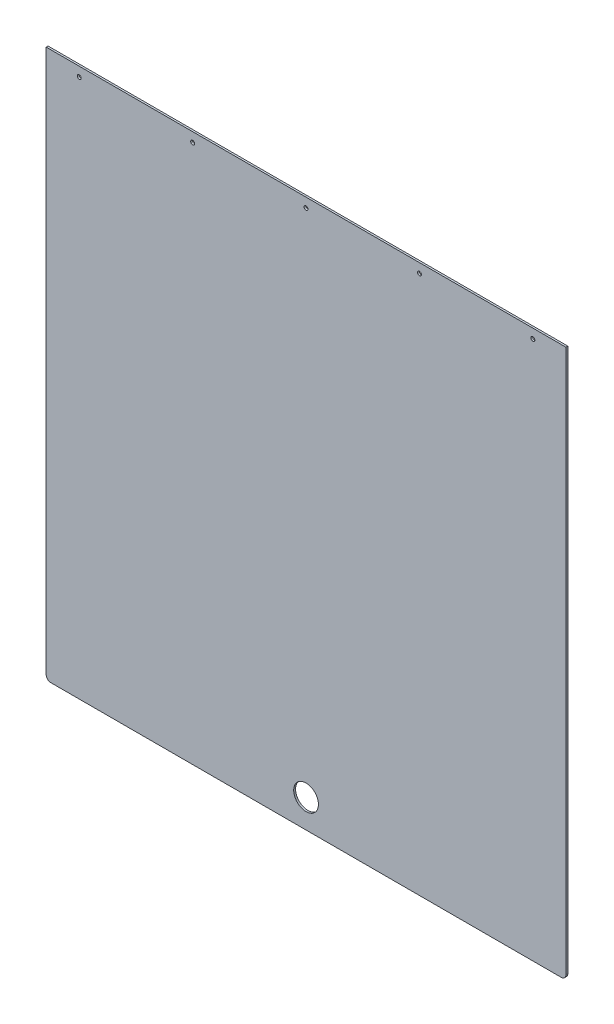
ISO-10303-21;
HEADER;
FILE_DESCRIPTION(('STEP AP214'),'2;1');
FILE_NAME('part.step','',(''),(''),'','','');
FILE_SCHEMA(('AUTOMOTIVE_DESIGN { 1 0 10303 214 1 1 1 1 }'));
ENDSEC;
DATA;
#1=APPLICATION_CONTEXT('core data for automotive mechanical design processes');
#2=APPLICATION_PROTOCOL_DEFINITION('international standard','automotive_design',2000,#1);
#3=PRODUCT_CONTEXT('',#1,'mechanical');
#4=PRODUCT('Part','Part','',(#3));
#5=PRODUCT_RELATED_PRODUCT_CATEGORY('part','',(#4));
#6=PRODUCT_DEFINITION_FORMATION('','',#4);
#7=PRODUCT_DEFINITION_CONTEXT('part definition',#1,'design');
#8=PRODUCT_DEFINITION('design','',#6,#7);
#9=PRODUCT_DEFINITION_SHAPE('','',#8);
#10=(LENGTH_UNIT() NAMED_UNIT(*) SI_UNIT(.MILLI.,.METRE.));
#11=(NAMED_UNIT(*) PLANE_ANGLE_UNIT() SI_UNIT($,.RADIAN.));
#12=(NAMED_UNIT(*) SI_UNIT($,.STERADIAN.) SOLID_ANGLE_UNIT());
#13=UNCERTAINTY_MEASURE_WITH_UNIT(LENGTH_MEASURE(1.E-05),#10,'distance_accuracy_value','');
#14=(GEOMETRIC_REPRESENTATION_CONTEXT(3) GLOBAL_UNCERTAINTY_ASSIGNED_CONTEXT((#13)) GLOBAL_UNIT_ASSIGNED_CONTEXT((#10,
#11,#12)) REPRESENTATION_CONTEXT('',''));
#15=CARTESIAN_POINT('',(0.,0.,0.));
#16=DIRECTION('',(0.,0.,1.));
#17=DIRECTION('',(1.,0.,0.));
#18=AXIS2_PLACEMENT_3D('',#15,#16,#17);
#19=CARTESIAN_POINT('',(275.,-290.,-2.));
#20=DIRECTION('',(1.,0.,0.));
#21=DIRECTION('',(0.,0.,-1.));
#22=AXIS2_PLACEMENT_3D('',#19,#20,#21);
#23=PLANE('',#22);
#24=DIRECTION('',(0.,1.,0.));
#25=VECTOR('',#24,1.);
#26=CARTESIAN_POINT('',(275.,-290.,0.));
#27=LINE('',#26,#25);
#28=CARTESIAN_POINT('',(275.,-285.,0.));
#29=VERTEX_POINT('',#28);
#30=CARTESIAN_POINT('',(275.,290.,0.));
#31=VERTEX_POINT('',#30);
#32=EDGE_CURVE('E111',#29,#31,#27,.T.);
#33=ORIENTED_EDGE('',*,*,#32,.F.);
#34=DIRECTION('',(0.,0.,1.));
#35=VECTOR('',#34,1.);
#36=CARTESIAN_POINT('',(275.,-285.,-2.));
#37=LINE('',#36,#35);
#38=CARTESIAN_POINT('',(275.,-285.,-2.));
#39=VERTEX_POINT('',#38);
#40=EDGE_CURVE('E11',#29,#39,#37,.F.);
#41=ORIENTED_EDGE('',*,*,#40,.T.);
#42=DIRECTION('',(0.,1.,0.));
#43=VECTOR('',#42,1.);
#44=CARTESIAN_POINT('',(275.,-290.,-2.));
#45=LINE('',#44,#43);
#46=CARTESIAN_POINT('',(275.,290.,-2.));
#47=VERTEX_POINT('',#46);
#48=EDGE_CURVE('E86',#39,#47,#45,.T.);
#49=ORIENTED_EDGE('',*,*,#48,.T.);
#50=DIRECTION('',(0.,0.,1.));
#51=VECTOR('',#50,1.);
#52=CARTESIAN_POINT('',(275.,290.,-2.));
#53=LINE('',#52,#51);
#54=EDGE_CURVE('E88',#47,#31,#53,.T.);
#55=ORIENTED_EDGE('',*,*,#54,.T.);
#56=EDGE_LOOP('',(#33,#41,#49,#55));
#57=FACE_BOUND('',#56,.T.);
#58=ADVANCED_FACE('F35',(#57),#23,.T.);
#59=CARTESIAN_POINT('',(-275.,-290.,-2.));
#60=DIRECTION('',(0.,-1.,0.));
#61=DIRECTION('',(0.,0.,-1.));
#62=AXIS2_PLACEMENT_3D('',#59,#60,#61);
#63=PLANE('',#62);
#64=DIRECTION('',(1.,0.,0.));
#65=VECTOR('',#64,1.);
#66=CARTESIAN_POINT('',(-275.,-290.,0.));
#67=LINE('',#66,#65);
#68=CARTESIAN_POINT('',(-270.,-290.,0.));
#69=VERTEX_POINT('',#68);
#70=CARTESIAN_POINT('',(270.,-290.,0.));
#71=VERTEX_POINT('',#70);
#72=EDGE_CURVE('E92',#69,#71,#67,.T.);
#73=ORIENTED_EDGE('',*,*,#72,.F.);
#74=DIRECTION('',(0.,0.,1.));
#75=VECTOR('',#74,1.);
#76=CARTESIAN_POINT('',(-270.,-290.,-2.));
#77=LINE('',#76,#75);
#78=CARTESIAN_POINT('',(-270.,-290.,-2.));
#79=VERTEX_POINT('',#78);
#80=EDGE_CURVE('E131',#69,#79,#77,.F.);
#81=ORIENTED_EDGE('',*,*,#80,.T.);
#82=DIRECTION('',(1.,0.,0.));
#83=VECTOR('',#82,1.);
#84=CARTESIAN_POINT('',(-275.,-290.,-2.));
#85=LINE('',#84,#83);
#86=CARTESIAN_POINT('',(270.,-290.,-2.));
#87=VERTEX_POINT('',#86);
#88=EDGE_CURVE('E100',#79,#87,#85,.T.);
#89=ORIENTED_EDGE('',*,*,#88,.T.);
#90=DIRECTION('',(0.,0.,1.));
#91=VECTOR('',#90,1.);
#92=CARTESIAN_POINT('',(270.,-290.,-2.));
#93=LINE('',#92,#91);
#94=EDGE_CURVE('E128',#87,#71,#93,.T.);
#95=ORIENTED_EDGE('',*,*,#94,.T.);
#96=EDGE_LOOP('',(#73,#81,#89,#95));
#97=FACE_BOUND('',#96,.T.);
#98=ADVANCED_FACE('F145',(#97),#63,.T.);
#99=CARTESIAN_POINT('',(-275.,-290.,-2.));
#100=DIRECTION('',(-1.,0.,0.));
#101=DIRECTION('',(0.,0.,1.));
#102=AXIS2_PLACEMENT_3D('',#99,#100,#101);
#103=PLANE('',#102);
#104=DIRECTION('',(0.,-1.,0.));
#105=VECTOR('',#104,1.);
#106=CARTESIAN_POINT('',(-275.,-290.,-2.));
#107=LINE('',#106,#105);
#108=CARTESIAN_POINT('',(-275.,290.,-2.));
#109=VERTEX_POINT('',#108);
#110=CARTESIAN_POINT('',(-275.,-285.,-2.));
#111=VERTEX_POINT('',#110);
#112=EDGE_CURVE('E105',#109,#111,#107,.T.);
#113=ORIENTED_EDGE('',*,*,#112,.T.);
#114=DIRECTION('',(0.,0.,1.));
#115=VECTOR('',#114,1.);
#116=CARTESIAN_POINT('',(-275.,-285.,-2.));
#117=LINE('',#116,#115);
#118=CARTESIAN_POINT('',(-275.,-285.,0.));
#119=VERTEX_POINT('',#118);
#120=EDGE_CURVE('E120',#111,#119,#117,.T.);
#121=ORIENTED_EDGE('',*,*,#120,.T.);
#122=DIRECTION('',(0.,-1.,0.));
#123=VECTOR('',#122,1.);
#124=CARTESIAN_POINT('',(-275.,-290.,0.));
#125=LINE('',#124,#123);
#126=CARTESIAN_POINT('',(-275.,290.,0.));
#127=VERTEX_POINT('',#126);
#128=EDGE_CURVE('E115',#127,#119,#125,.T.);
#129=ORIENTED_EDGE('',*,*,#128,.F.);
#130=DIRECTION('',(0.,0.,1.));
#131=VECTOR('',#130,1.);
#132=CARTESIAN_POINT('',(-275.,290.,-2.));
#133=LINE('',#132,#131);
#134=EDGE_CURVE('E99',#109,#127,#133,.T.);
#135=ORIENTED_EDGE('',*,*,#134,.F.);
#136=EDGE_LOOP('',(#113,#121,#129,#135));
#137=FACE_BOUND('',#136,.T.);
#138=ADVANCED_FACE('F138',(#137),#103,.T.);
#139=CARTESIAN_POINT('',(-275.,290.,-2.));
#140=DIRECTION('',(0.,1.,0.));
#141=DIRECTION('',(0.,0.,1.));
#142=AXIS2_PLACEMENT_3D('',#139,#140,#141);
#143=PLANE('',#142);
#144=DIRECTION('',(-1.,0.,0.));
#145=VECTOR('',#144,1.);
#146=CARTESIAN_POINT('',(-275.,290.,0.));
#147=LINE('',#146,#145);
#148=EDGE_CURVE('E98',#31,#127,#147,.T.);
#149=ORIENTED_EDGE('',*,*,#148,.F.);
#150=ORIENTED_EDGE('',*,*,#54,.F.);
#151=DIRECTION('',(-1.,0.,0.));
#152=VECTOR('',#151,1.);
#153=CARTESIAN_POINT('',(-275.,290.,-2.));
#154=LINE('',#153,#152);
#155=EDGE_CURVE('E91',#47,#109,#154,.T.);
#156=ORIENTED_EDGE('',*,*,#155,.T.);
#157=ORIENTED_EDGE('',*,*,#134,.T.);
#158=EDGE_LOOP('',(#149,#150,#156,#157));
#159=FACE_BOUND('',#158,.T.);
#160=ADVANCED_FACE('F96',(#159),#143,.T.);
#161=CARTESIAN_POINT('',(0.,0.,-2.));
#162=DIRECTION('',(0.,0.,-1.));
#163=DIRECTION('',(-1.,0.,0.));
#164=AXIS2_PLACEMENT_3D('',#161,#162,#163);
#165=PLANE('',#164);
#166=CARTESIAN_POINT('',(0.,-260.,-2.));
#167=DIRECTION('',(0.,0.,-1.));
#168=DIRECTION('',(-1.,0.,0.));
#169=AXIS2_PLACEMENT_3D('',#166,#167,#168);
#170=CIRCLE('',#169,13.1);
#171=CARTESIAN_POINT('',(-13.0999999999999,-260.,-2.));
#172=VERTEX_POINT('',#171);
#173=EDGE_CURVE('E197',#172,#172,#170,.T.);
#174=ORIENTED_EDGE('',*,*,#173,.F.);
#175=EDGE_LOOP('',(#174));
#176=FACE_BOUND('',#175,.T.);
#177=CARTESIAN_POINT('',(-120.,280.,-2.));
#178=DIRECTION('',(0.,0.,-1.));
#179=DIRECTION('',(-1.,0.,0.));
#180=AXIS2_PLACEMENT_3D('',#177,#178,#179);
#181=CIRCLE('',#180,2.1);
#182=CARTESIAN_POINT('',(-122.1,280.,-2.));
#183=VERTEX_POINT('',#182);
#184=EDGE_CURVE('E201',#183,#183,#181,.F.);
#185=ORIENTED_EDGE('',*,*,#184,.T.);
#186=EDGE_LOOP('',(#185));
#187=FACE_BOUND('',#186,.T.);
#188=CARTESIAN_POINT('',(-240.,280.,-2.));
#189=DIRECTION('',(0.,0.,-1.));
#190=DIRECTION('',(-1.,0.,0.));
#191=AXIS2_PLACEMENT_3D('',#188,#189,#190);
#192=CIRCLE('',#191,2.09999999999999);
#193=CARTESIAN_POINT('',(-242.1,280.,-2.));
#194=VERTEX_POINT('',#193);
#195=EDGE_CURVE('E224',#194,#194,#192,.F.);
#196=ORIENTED_EDGE('',*,*,#195,.T.);
#197=EDGE_LOOP('',(#196));
#198=FACE_BOUND('',#197,.T.);
#199=CARTESIAN_POINT('',(240.,280.,-2.));
#200=DIRECTION('',(0.,0.,-1.));
#201=DIRECTION('',(-1.,0.,0.));
#202=AXIS2_PLACEMENT_3D('',#199,#200,#201);
#203=CIRCLE('',#202,2.09999999999999);
#204=CARTESIAN_POINT('',(237.9,280.,-2.));
#205=VERTEX_POINT('',#204);
#206=EDGE_CURVE('E218',#205,#205,#203,.F.);
#207=ORIENTED_EDGE('',*,*,#206,.T.);
#208=EDGE_LOOP('',(#207));
#209=FACE_BOUND('',#208,.T.);
#210=CARTESIAN_POINT('',(120.,280.,-2.));
#211=DIRECTION('',(0.,0.,-1.));
#212=DIRECTION('',(-1.,0.,0.));
#213=AXIS2_PLACEMENT_3D('',#210,#211,#212);
#214=CIRCLE('',#213,2.1);
#215=CARTESIAN_POINT('',(117.9,280.,-2.));
#216=VERTEX_POINT('',#215);
#217=EDGE_CURVE('E212',#216,#216,#214,.F.);
#218=ORIENTED_EDGE('',*,*,#217,.T.);
#219=EDGE_LOOP('',(#218));
#220=FACE_BOUND('',#219,.T.);
#221=CARTESIAN_POINT('',(0.,280.,-2.));
#222=DIRECTION('',(0.,0.,-1.));
#223=DIRECTION('',(-1.,0.,0.));
#224=AXIS2_PLACEMENT_3D('',#221,#222,#223);
#225=CIRCLE('',#224,2.1);
#226=CARTESIAN_POINT('',(-2.1,280.,-2.));
#227=VERTEX_POINT('',#226);
#228=EDGE_CURVE('E211',#227,#227,#225,.F.);
#229=ORIENTED_EDGE('',*,*,#228,.T.);
#230=EDGE_LOOP('',(#229));
#231=FACE_BOUND('',#230,.T.);
#232=ORIENTED_EDGE('',*,*,#88,.F.);
#233=CARTESIAN_POINT('',(-270.,-285.,-2.));
#234=DIRECTION('',(0.,0.,-1.));
#235=DIRECTION('',(-1.,0.,0.));
#236=AXIS2_PLACEMENT_3D('',#233,#234,#235);
#237=CIRCLE('',#236,5.);
#238=EDGE_CURVE('E43',#79,#111,#237,.T.);
#239=ORIENTED_EDGE('',*,*,#238,.T.);
#240=ORIENTED_EDGE('',*,*,#112,.F.);
#241=ORIENTED_EDGE('',*,*,#155,.F.);
#242=ORIENTED_EDGE('',*,*,#48,.F.);
#243=CARTESIAN_POINT('',(270.,-285.,-2.));
#244=DIRECTION('',(0.,0.,-1.));
#245=DIRECTION('',(-1.,0.,0.));
#246=AXIS2_PLACEMENT_3D('',#243,#244,#245);
#247=CIRCLE('',#246,5.);
#248=EDGE_CURVE('E55',#39,#87,#247,.T.);
#249=ORIENTED_EDGE('',*,*,#248,.T.);
#250=EDGE_LOOP('',(#232,#239,#240,#241,#242,#249));
#251=FACE_BOUND('',#250,.T.);
#252=ADVANCED_FACE('F103',(#176,#187,#198,#209,#220,#231,#251),#165,.T.);
#253=CARTESIAN_POINT('',(0.,0.,0.));
#254=DIRECTION('',(0.,0.,-1.));
#255=DIRECTION('',(-1.,0.,0.));
#256=AXIS2_PLACEMENT_3D('',#253,#254,#255);
#257=PLANE('',#256);
#258=CARTESIAN_POINT('',(0.,-260.,0.));
#259=DIRECTION('',(0.,0.,-1.));
#260=DIRECTION('',(-1.,0.,0.));
#261=AXIS2_PLACEMENT_3D('',#258,#259,#260);
#262=CIRCLE('',#261,13.1);
#263=CARTESIAN_POINT('',(-13.0999999999999,-260.,0.));
#264=VERTEX_POINT('',#263);
#265=EDGE_CURVE('E200',#264,#264,#262,.F.);
#266=ORIENTED_EDGE('',*,*,#265,.F.);
#267=EDGE_LOOP('',(#266));
#268=FACE_BOUND('',#267,.T.);
#269=CARTESIAN_POINT('',(-120.,280.,0.));
#270=DIRECTION('',(0.,0.,1.));
#271=DIRECTION('',(-1.,0.,0.));
#272=AXIS2_PLACEMENT_3D('',#269,#270,#271);
#273=CIRCLE('',#272,2.1);
#274=CARTESIAN_POINT('',(-122.1,280.,0.));
#275=VERTEX_POINT('',#274);
#276=EDGE_CURVE('E204',#275,#275,#273,.T.);
#277=ORIENTED_EDGE('',*,*,#276,.F.);
#278=EDGE_LOOP('',(#277));
#279=FACE_BOUND('',#278,.T.);
#280=CARTESIAN_POINT('',(-240.,280.,0.));
#281=DIRECTION('',(0.,0.,1.));
#282=DIRECTION('',(-1.,0.,0.));
#283=AXIS2_PLACEMENT_3D('',#280,#281,#282);
#284=CIRCLE('',#283,2.09999999999999);
#285=CARTESIAN_POINT('',(-242.1,280.,0.));
#286=VERTEX_POINT('',#285);
#287=EDGE_CURVE('E221',#286,#286,#284,.T.);
#288=ORIENTED_EDGE('',*,*,#287,.F.);
#289=EDGE_LOOP('',(#288));
#290=FACE_BOUND('',#289,.T.);
#291=CARTESIAN_POINT('',(240.,280.,0.));
#292=DIRECTION('',(0.,0.,1.));
#293=DIRECTION('',(1.,0.,0.));
#294=AXIS2_PLACEMENT_3D('',#291,#292,#293);
#295=CIRCLE('',#294,2.09999999999999);
#296=CARTESIAN_POINT('',(242.1,280.,0.));
#297=VERTEX_POINT('',#296);
#298=EDGE_CURVE('E215',#297,#297,#295,.T.);
#299=ORIENTED_EDGE('',*,*,#298,.F.);
#300=EDGE_LOOP('',(#299));
#301=FACE_BOUND('',#300,.T.);
#302=CARTESIAN_POINT('',(120.,280.,0.));
#303=DIRECTION('',(0.,0.,1.));
#304=DIRECTION('',(1.,0.,0.));
#305=AXIS2_PLACEMENT_3D('',#302,#303,#304);
#306=CIRCLE('',#305,2.1);
#307=CARTESIAN_POINT('',(122.1,280.,0.));
#308=VERTEX_POINT('',#307);
#309=EDGE_CURVE('E208',#308,#308,#306,.T.);
#310=ORIENTED_EDGE('',*,*,#309,.F.);
#311=EDGE_LOOP('',(#310));
#312=FACE_BOUND('',#311,.T.);
#313=CARTESIAN_POINT('',(0.,280.,0.));
#314=DIRECTION('',(0.,0.,1.));
#315=DIRECTION('',(1.,0.,0.));
#316=AXIS2_PLACEMENT_3D('',#313,#314,#315);
#317=CIRCLE('',#316,2.1);
#318=CARTESIAN_POINT('',(2.1,280.,0.));
#319=VERTEX_POINT('',#318);
#320=EDGE_CURVE('E113',#319,#319,#317,.T.);
#321=ORIENTED_EDGE('',*,*,#320,.F.);
#322=EDGE_LOOP('',(#321));
#323=FACE_BOUND('',#322,.T.);
#324=ORIENTED_EDGE('',*,*,#128,.T.);
#325=CARTESIAN_POINT('',(-270.,-285.,0.));
#326=DIRECTION('',(0.,0.,-1.));
#327=DIRECTION('',(-1.,0.,0.));
#328=AXIS2_PLACEMENT_3D('',#325,#326,#327);
#329=CIRCLE('',#328,5.);
#330=EDGE_CURVE('E126',#119,#69,#329,.F.);
#331=ORIENTED_EDGE('',*,*,#330,.T.);
#332=ORIENTED_EDGE('',*,*,#72,.T.);
#333=CARTESIAN_POINT('',(270.,-285.,0.));
#334=DIRECTION('',(0.,0.,-1.));
#335=DIRECTION('',(-1.,0.,0.));
#336=AXIS2_PLACEMENT_3D('',#333,#334,#335);
#337=CIRCLE('',#336,5.);
#338=EDGE_CURVE('E124',#71,#29,#337,.F.);
#339=ORIENTED_EDGE('',*,*,#338,.T.);
#340=ORIENTED_EDGE('',*,*,#32,.T.);
#341=ORIENTED_EDGE('',*,*,#148,.T.);
#342=EDGE_LOOP('',(#324,#331,#332,#339,#340,#341));
#343=FACE_BOUND('',#342,.T.);
#344=ADVANCED_FACE('F143',(#268,#279,#290,#301,#312,#323,#343),#257,.F.);
#345=CARTESIAN_POINT('',(-270.,-285.,-2.));
#346=DIRECTION('',(0.,0.,1.));
#347=DIRECTION('',(1.,0.,0.));
#348=AXIS2_PLACEMENT_3D('',#345,#346,#347);
#349=CYLINDRICAL_SURFACE('',#348,5.);
#350=ORIENTED_EDGE('',*,*,#238,.F.);
#351=ORIENTED_EDGE('',*,*,#80,.F.);
#352=ORIENTED_EDGE('',*,*,#330,.F.);
#353=ORIENTED_EDGE('',*,*,#120,.F.);
#354=EDGE_LOOP('',(#350,#351,#352,#353));
#355=FACE_BOUND('',#354,.T.);
#356=ADVANCED_FACE('F140',(#355),#349,.T.);
#357=CARTESIAN_POINT('',(270.,-285.,-2.));
#358=DIRECTION('',(0.,0.,1.));
#359=DIRECTION('',(1.,0.,0.));
#360=AXIS2_PLACEMENT_3D('',#357,#358,#359);
#361=CYLINDRICAL_SURFACE('',#360,5.);
#362=ORIENTED_EDGE('',*,*,#248,.F.);
#363=ORIENTED_EDGE('',*,*,#40,.F.);
#364=ORIENTED_EDGE('',*,*,#338,.F.);
#365=ORIENTED_EDGE('',*,*,#94,.F.);
#366=EDGE_LOOP('',(#362,#363,#364,#365));
#367=FACE_BOUND('',#366,.T.);
#368=ADVANCED_FACE('F37',(#367),#361,.T.);
#369=CARTESIAN_POINT('',(0.,280.,-2.001));
#370=DIRECTION('',(0.,0.,1.));
#371=DIRECTION('',(1.,0.,0.));
#372=AXIS2_PLACEMENT_3D('',#369,#370,#371);
#373=CYLINDRICAL_SURFACE('',#372,2.1);
#374=ORIENTED_EDGE('',*,*,#228,.F.);
#375=EDGE_LOOP('',(#374));
#376=FACE_BOUND('',#375,.T.);
#377=ORIENTED_EDGE('',*,*,#320,.T.);
#378=EDGE_LOOP('',(#377));
#379=FACE_BOUND('',#378,.T.);
#380=ADVANCED_FACE('F149',(#376,#379),#373,.F.);
#381=CARTESIAN_POINT('',(120.,280.,-2.001));
#382=DIRECTION('',(0.,0.,1.));
#383=DIRECTION('',(1.,0.,0.));
#384=AXIS2_PLACEMENT_3D('',#381,#382,#383);
#385=CYLINDRICAL_SURFACE('',#384,2.1);
#386=ORIENTED_EDGE('',*,*,#217,.F.);
#387=EDGE_LOOP('',(#386));
#388=FACE_BOUND('',#387,.T.);
#389=ORIENTED_EDGE('',*,*,#309,.T.);
#390=EDGE_LOOP('',(#389));
#391=FACE_BOUND('',#390,.T.);
#392=ADVANCED_FACE('F154',(#388,#391),#385,.F.);
#393=CARTESIAN_POINT('',(240.,280.,-2.001));
#394=DIRECTION('',(0.,0.,1.));
#395=DIRECTION('',(1.,0.,0.));
#396=AXIS2_PLACEMENT_3D('',#393,#394,#395);
#397=CYLINDRICAL_SURFACE('',#396,2.09999999999999);
#398=ORIENTED_EDGE('',*,*,#206,.F.);
#399=EDGE_LOOP('',(#398));
#400=FACE_BOUND('',#399,.T.);
#401=ORIENTED_EDGE('',*,*,#298,.T.);
#402=EDGE_LOOP('',(#401));
#403=FACE_BOUND('',#402,.T.);
#404=ADVANCED_FACE('F182',(#400,#403),#397,.F.);
#405=CARTESIAN_POINT('',(-240.,280.,-2.001));
#406=DIRECTION('',(0.,0.,1.));
#407=DIRECTION('',(1.,0.,0.));
#408=AXIS2_PLACEMENT_3D('',#405,#406,#407);
#409=CYLINDRICAL_SURFACE('',#408,2.09999999999999);
#410=ORIENTED_EDGE('',*,*,#195,.F.);
#411=EDGE_LOOP('',(#410));
#412=FACE_BOUND('',#411,.T.);
#413=ORIENTED_EDGE('',*,*,#287,.T.);
#414=EDGE_LOOP('',(#413));
#415=FACE_BOUND('',#414,.T.);
#416=ADVANCED_FACE('F178',(#412,#415),#409,.F.);
#417=CARTESIAN_POINT('',(-120.,280.,-2.001));
#418=DIRECTION('',(0.,0.,1.));
#419=DIRECTION('',(1.,0.,0.));
#420=AXIS2_PLACEMENT_3D('',#417,#418,#419);
#421=CYLINDRICAL_SURFACE('',#420,2.1);
#422=ORIENTED_EDGE('',*,*,#184,.F.);
#423=EDGE_LOOP('',(#422));
#424=FACE_BOUND('',#423,.T.);
#425=ORIENTED_EDGE('',*,*,#276,.T.);
#426=EDGE_LOOP('',(#425));
#427=FACE_BOUND('',#426,.T.);
#428=ADVANCED_FACE('F174',(#424,#427),#421,.F.);
#429=CARTESIAN_POINT('',(0.,-260.,0.00100000000000013));
#430=DIRECTION('',(0.,0.,-1.));
#431=DIRECTION('',(-1.,0.,0.));
#432=AXIS2_PLACEMENT_3D('',#429,#430,#431);
#433=CYLINDRICAL_SURFACE('',#432,13.1);
#434=ORIENTED_EDGE('',*,*,#173,.T.);
#435=EDGE_LOOP('',(#434));
#436=FACE_BOUND('',#435,.T.);
#437=ORIENTED_EDGE('',*,*,#265,.T.);
#438=EDGE_LOOP('',(#437));
#439=FACE_BOUND('',#438,.T.);
#440=ADVANCED_FACE('F177',(#436,#439),#433,.F.);
#441=CLOSED_SHELL('',(#58,#98,#138,#160,#252,#344,#356,#368,#380,#392,#404,#416,#428,#440));
#442=MANIFOLD_SOLID_BREP('B2',#441);
#443=ADVANCED_BREP_SHAPE_REPRESENTATION('',(#18,#442),#14);
#444=SHAPE_DEFINITION_REPRESENTATION(#9,#443);
ENDSEC;
END-ISO-10303-21;
